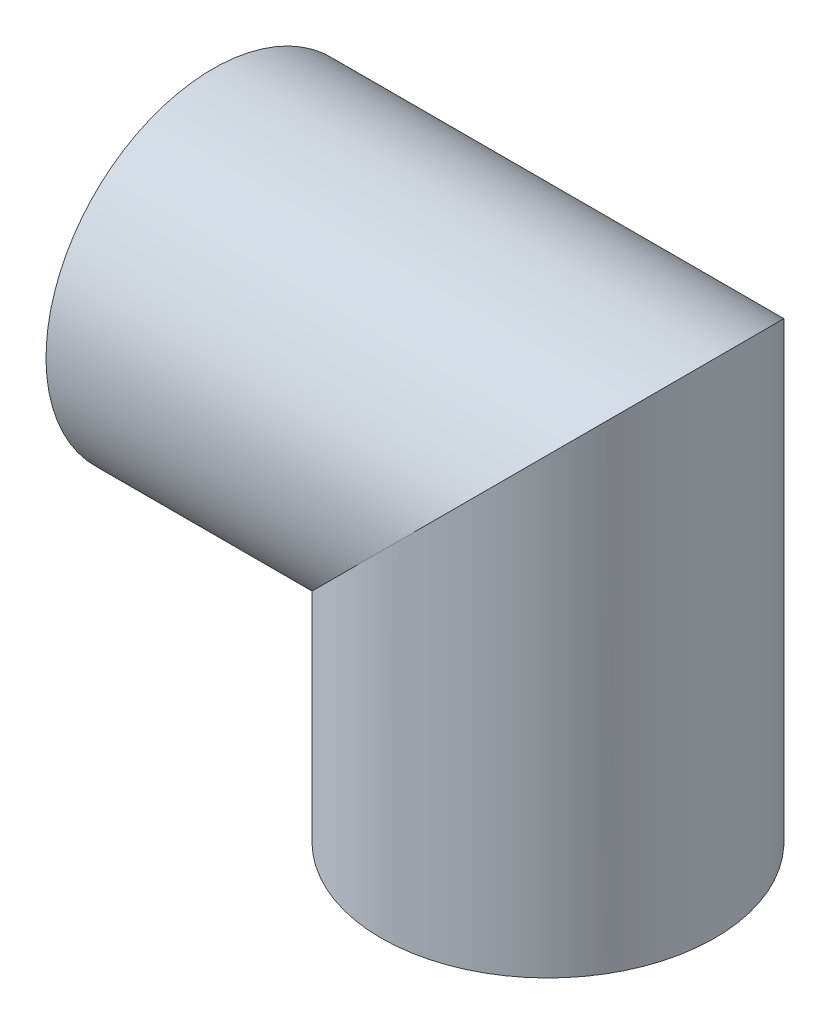
ISO-10303-21;
HEADER;
FILE_DESCRIPTION(('STEP AP214'),'2;1');
FILE_NAME('part.step','',(''),(''),'','','');
FILE_SCHEMA(('AUTOMOTIVE_DESIGN { 1 0 10303 214 1 1 1 1 }'));
ENDSEC;
DATA;
#1=APPLICATION_CONTEXT('core data for automotive mechanical design processes');
#2=APPLICATION_PROTOCOL_DEFINITION('international standard','automotive_design',2000,#1);
#3=PRODUCT_CONTEXT('',#1,'mechanical');
#4=PRODUCT('Part','Part','',(#3));
#5=PRODUCT_RELATED_PRODUCT_CATEGORY('part','',(#4));
#6=PRODUCT_DEFINITION_FORMATION('','',#4);
#7=PRODUCT_DEFINITION_CONTEXT('part definition',#1,'design');
#8=PRODUCT_DEFINITION('design','',#6,#7);
#9=PRODUCT_DEFINITION_SHAPE('','',#8);
#10=(LENGTH_UNIT() NAMED_UNIT(*) SI_UNIT(.MILLI.,.METRE.));
#11=(NAMED_UNIT(*) PLANE_ANGLE_UNIT() SI_UNIT($,.RADIAN.));
#12=(NAMED_UNIT(*) SI_UNIT($,.STERADIAN.) SOLID_ANGLE_UNIT());
#13=UNCERTAINTY_MEASURE_WITH_UNIT(LENGTH_MEASURE(1.E-05),#10,'distance_accuracy_value','');
#14=(GEOMETRIC_REPRESENTATION_CONTEXT(3) GLOBAL_UNCERTAINTY_ASSIGNED_CONTEXT((#13)) GLOBAL_UNIT_ASSIGNED_CONTEXT((#10,
#11,#12)) REPRESENTATION_CONTEXT('',''));
#15=CARTESIAN_POINT('',(0.,0.,0.));
#16=DIRECTION('',(0.,0.,1.));
#17=DIRECTION('',(1.,0.,0.));
#18=AXIS2_PLACEMENT_3D('',#15,#16,#17);
#19=CARTESIAN_POINT('',(10.3342576147178,-25.4,0.));
#20=DIRECTION('',(0.,1.,0.));
#21=DIRECTION('',(0.,0.,1.));
#22=AXIS2_PLACEMENT_3D('',#19,#20,#21);
#23=PLANE('',#22);
#24=CARTESIAN_POINT('',(10.3342576147178,-25.4,0.));
#25=DIRECTION('',(0.,1.,0.));
#26=DIRECTION('',(0.,0.,1.));
#27=AXIS2_PLACEMENT_3D('',#24,#25,#26);
#28=CIRCLE('',#27,10.65);
#29=CARTESIAN_POINT('',(10.3342576147178,-25.4,10.65));
#30=VERTEX_POINT('',#29);
#31=EDGE_CURVE('E57',#30,#30,#28,.T.);
#32=ORIENTED_EDGE('',*,*,#31,.T.);
#33=EDGE_LOOP('',(#32));
#34=FACE_BOUND('',#33,.T.);
#35=CARTESIAN_POINT('',(10.3342576147178,-25.4,0.));
#36=DIRECTION('',(0.,1.,0.));
#37=DIRECTION('',(0.,0.,1.));
#38=AXIS2_PLACEMENT_3D('',#35,#36,#37);
#39=CIRCLE('',#38,12.65);
#40=CARTESIAN_POINT('',(10.3342576147178,-25.4,12.65));
#41=VERTEX_POINT('',#40);
#42=EDGE_CURVE('E55',#41,#41,#39,.T.);
#43=ORIENTED_EDGE('',*,*,#42,.F.);
#44=EDGE_LOOP('',(#43));
#45=FACE_BOUND('',#44,.T.);
#46=ADVANCED_FACE('F40',(#34,#45),#23,.F.);
#47=CARTESIAN_POINT('',(-15.0657423852822,0.,0.));
#48=DIRECTION('',(-1.,0.,0.));
#49=DIRECTION('',(0.,0.,1.));
#50=AXIS2_PLACEMENT_3D('',#47,#48,#49);
#51=PLANE('',#50);
#52=CARTESIAN_POINT('',(-15.0657423852822,0.,0.));
#53=DIRECTION('',(-1.,0.,0.));
#54=DIRECTION('',(0.,0.,1.));
#55=AXIS2_PLACEMENT_3D('',#52,#53,#54);
#56=CIRCLE('',#55,10.65);
#57=CARTESIAN_POINT('',(-15.0657423852822,0.,10.65));
#58=VERTEX_POINT('',#57);
#59=EDGE_CURVE('E67',#58,#58,#56,.T.);
#60=ORIENTED_EDGE('',*,*,#59,.F.);
#61=EDGE_LOOP('',(#60));
#62=FACE_BOUND('',#61,.T.);
#63=CARTESIAN_POINT('',(-15.0657423852822,0.,0.));
#64=DIRECTION('',(-1.,0.,0.));
#65=DIRECTION('',(0.,-1.,0.));
#66=AXIS2_PLACEMENT_3D('',#63,#64,#65);
#67=CIRCLE('',#66,12.65);
#68=CARTESIAN_POINT('',(-15.0657423852822,-12.65,0.));
#69=VERTEX_POINT('',#68);
#70=EDGE_CURVE('E44',#69,#69,#67,.T.);
#71=ORIENTED_EDGE('',*,*,#70,.T.);
#72=EDGE_LOOP('',(#71));
#73=FACE_BOUND('',#72,.T.);
#74=ADVANCED_FACE('F97',(#62,#73),#51,.T.);
#75=CARTESIAN_POINT('',(10.3342576147178,23.53,0.));
#76=DIRECTION('',(0.,-1.,0.));
#77=DIRECTION('',(1.,0.,0.));
#78=AXIS2_PLACEMENT_3D('',#75,#76,#77);
#79=CYLINDRICAL_SURFACE('',#78,12.65);
#80=CARTESIAN_POINT('',(10.3342576147178,0.,0.));
#81=DIRECTION('',(0.707106781186548,-0.707106781186547,0.));
#82=DIRECTION('',(-0.707106781186547,-0.707106781186548,0.));
#83=AXIS2_PLACEMENT_3D('',#80,#81,#82);
#84=ELLIPSE('',#83,17.8898015640197,12.65);
#85=CARTESIAN_POINT('',(-2.31574238528222,-12.65,0.));
#86=VERTEX_POINT('',#85);
#87=EDGE_CURVE('E11',#86,#86,#84,.T.);
#88=ORIENTED_EDGE('',*,*,#87,.T.);
#89=EDGE_LOOP('',(#88));
#90=FACE_BOUND('',#89,.T.);
#91=ORIENTED_EDGE('',*,*,#42,.T.);
#92=EDGE_LOOP('',(#91));
#93=FACE_BOUND('',#92,.T.);
#94=ADVANCED_FACE('F94',(#90,#93),#79,.T.);
#95=CARTESIAN_POINT('',(-15.0657423852822,0.,0.));
#96=DIRECTION('',(1.,0.,0.));
#97=DIRECTION('',(0.,0.,-1.));
#98=AXIS2_PLACEMENT_3D('',#95,#96,#97);
#99=CYLINDRICAL_SURFACE('',#98,12.65);
#100=ORIENTED_EDGE('',*,*,#70,.F.);
#101=EDGE_LOOP('',(#100));
#102=FACE_BOUND('',#101,.T.);
#103=ORIENTED_EDGE('',*,*,#87,.F.);
#104=EDGE_LOOP('',(#103));
#105=FACE_BOUND('',#104,.T.);
#106=ADVANCED_FACE('F42',(#102,#105),#99,.T.);
#107=CARTESIAN_POINT('',(10.3342576147178,23.53,0.));
#108=DIRECTION('',(0.,-1.,0.));
#109=DIRECTION('',(1.,0.,0.));
#110=AXIS2_PLACEMENT_3D('',#107,#108,#109);
#111=CYLINDRICAL_SURFACE('',#110,10.65);
#112=CARTESIAN_POINT('',(10.3342576147178,0.,0.));
#113=DIRECTION('',(0.707106781186548,-0.707106781186547,0.));
#114=DIRECTION('',(0.707106781186547,0.707106781186548,0.));
#115=AXIS2_PLACEMENT_3D('',#112,#113,#114);
#116=ELLIPSE('',#115,15.0613744392735,10.65);
#117=CARTESIAN_POINT('',(20.9842576147178,10.65,0.));
#118=VERTEX_POINT('',#117);
#119=EDGE_CURVE('E61',#118,#118,#116,.T.);
#120=ORIENTED_EDGE('',*,*,#119,.F.);
#121=EDGE_LOOP('',(#120));
#122=FACE_BOUND('',#121,.T.);
#123=ORIENTED_EDGE('',*,*,#31,.F.);
#124=EDGE_LOOP('',(#123));
#125=FACE_BOUND('',#124,.T.);
#126=ADVANCED_FACE('F84',(#122,#125),#111,.F.);
#127=CARTESIAN_POINT('',(-15.0657423852822,0.,0.));
#128=DIRECTION('',(1.,0.,0.));
#129=DIRECTION('',(0.,0.,-1.));
#130=AXIS2_PLACEMENT_3D('',#127,#128,#129);
#131=CYLINDRICAL_SURFACE('',#130,10.65);
#132=ORIENTED_EDGE('',*,*,#59,.T.);
#133=EDGE_LOOP('',(#132));
#134=FACE_BOUND('',#133,.T.);
#135=ORIENTED_EDGE('',*,*,#119,.T.);
#136=EDGE_LOOP('',(#135));
#137=FACE_BOUND('',#136,.T.);
#138=ADVANCED_FACE('F86',(#134,#137),#131,.F.);
#139=CLOSED_SHELL('',(#46,#74,#94,#106,#126,#138));
#140=MANIFOLD_SOLID_BREP('B2',#139);
#141=ADVANCED_BREP_SHAPE_REPRESENTATION('',(#18,#140),#14);
#142=SHAPE_DEFINITION_REPRESENTATION(#9,#141);
ENDSEC;
END-ISO-10303-21;
